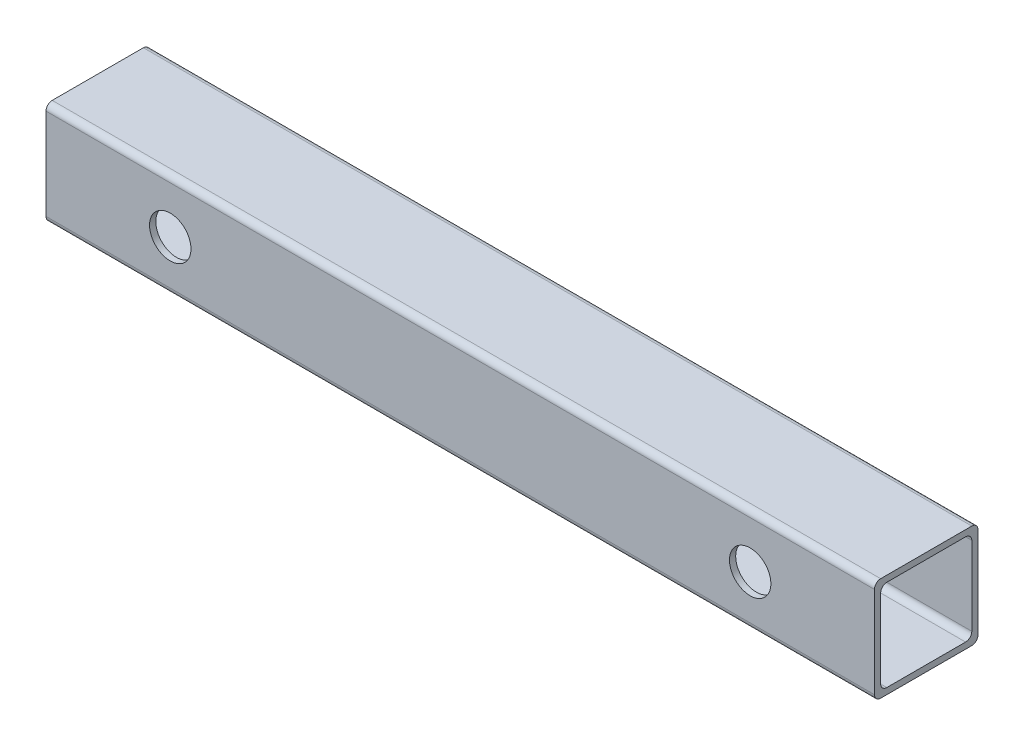
ISO-10303-21;
HEADER;
FILE_DESCRIPTION(('STEP AP214'),'2;1');
FILE_NAME('part.step','',(''),(''),'','','');
FILE_SCHEMA(('AUTOMOTIVE_DESIGN { 1 0 10303 214 1 1 1 1 }'));
ENDSEC;
DATA;
#1=APPLICATION_CONTEXT('core data for automotive mechanical design processes');
#2=APPLICATION_PROTOCOL_DEFINITION('international standard','automotive_design',2000,#1);
#3=PRODUCT_CONTEXT('',#1,'mechanical');
#4=PRODUCT('Part','Part','',(#3));
#5=PRODUCT_RELATED_PRODUCT_CATEGORY('part','',(#4));
#6=PRODUCT_DEFINITION_FORMATION('','',#4);
#7=PRODUCT_DEFINITION_CONTEXT('part definition',#1,'design');
#8=PRODUCT_DEFINITION('design','',#6,#7);
#9=PRODUCT_DEFINITION_SHAPE('','',#8);
#10=(LENGTH_UNIT() NAMED_UNIT(*) SI_UNIT(.MILLI.,.METRE.));
#11=(NAMED_UNIT(*) PLANE_ANGLE_UNIT() SI_UNIT($,.RADIAN.));
#12=(NAMED_UNIT(*) SI_UNIT($,.STERADIAN.) SOLID_ANGLE_UNIT());
#13=UNCERTAINTY_MEASURE_WITH_UNIT(LENGTH_MEASURE(1.E-05),#10,'distance_accuracy_value','');
#14=(GEOMETRIC_REPRESENTATION_CONTEXT(3) GLOBAL_UNCERTAINTY_ASSIGNED_CONTEXT((#13)) GLOBAL_UNIT_ASSIGNED_CONTEXT((#10,
#11,#12)) REPRESENTATION_CONTEXT('',''));
#15=CARTESIAN_POINT('',(0.,0.,0.));
#16=DIRECTION('',(0.,0.,1.));
#17=DIRECTION('',(1.,0.,0.));
#18=AXIS2_PLACEMENT_3D('',#15,#16,#17);
#19=CARTESIAN_POINT('',(200.,23.5,-23.5));
#20=DIRECTION('',(-1.,0.,0.));
#21=DIRECTION('',(0.,0.,1.));
#22=AXIS2_PLACEMENT_3D('',#19,#20,#21);
#23=PLANE('',#22);
#24=CARTESIAN_POINT('',(200.,23.5,-23.5));
#25=DIRECTION('',(1.,0.,0.));
#26=DIRECTION('',(0.,0.,1.));
#27=AXIS2_PLACEMENT_3D('',#24,#25,#26);
#28=CIRCLE('',#27,1.5);
#29=CARTESIAN_POINT('',(200.,23.5,-25.));
#30=VERTEX_POINT('',#29);
#31=CARTESIAN_POINT('',(200.,25.,-23.5));
#32=VERTEX_POINT('',#31);
#33=EDGE_CURVE('E215',#30,#32,#28,.T.);
#34=ORIENTED_EDGE('',*,*,#33,.T.);
#35=DIRECTION('',(0.,0.,1.));
#36=VECTOR('',#35,1.);
#37=CARTESIAN_POINT('',(200.,25.,-1.50000000000001));
#38=LINE('',#37,#36);
#39=CARTESIAN_POINT('',(200.,25.,-1.50000000000001));
#40=VERTEX_POINT('',#39);
#41=EDGE_CURVE('E218',#32,#40,#38,.T.);
#42=ORIENTED_EDGE('',*,*,#41,.T.);
#43=CARTESIAN_POINT('',(200.,23.5,-1.5));
#44=DIRECTION('',(1.,0.,0.));
#45=DIRECTION('',(0.,0.,1.));
#46=AXIS2_PLACEMENT_3D('',#43,#44,#45);
#47=CIRCLE('',#46,1.5);
#48=CARTESIAN_POINT('',(200.,23.5,0.));
#49=VERTEX_POINT('',#48);
#50=EDGE_CURVE('E221',#40,#49,#47,.T.);
#51=ORIENTED_EDGE('',*,*,#50,.T.);
#52=DIRECTION('',(0.,-1.,0.));
#53=VECTOR('',#52,1.);
#54=CARTESIAN_POINT('',(200.,1.50000000000001,0.));
#55=LINE('',#54,#53);
#56=CARTESIAN_POINT('',(200.,1.50000000000001,0.));
#57=VERTEX_POINT('',#56);
#58=EDGE_CURVE('E223',#49,#57,#55,.T.);
#59=ORIENTED_EDGE('',*,*,#58,.T.);
#60=CARTESIAN_POINT('',(200.,1.5,-1.5));
#61=DIRECTION('',(1.,0.,0.));
#62=DIRECTION('',(0.,0.,1.));
#63=AXIS2_PLACEMENT_3D('',#60,#61,#62);
#64=CIRCLE('',#63,1.5);
#65=CARTESIAN_POINT('',(200.,0.,-1.50000000000001));
#66=VERTEX_POINT('',#65);
#67=EDGE_CURVE('E225',#57,#66,#64,.T.);
#68=ORIENTED_EDGE('',*,*,#67,.T.);
#69=DIRECTION('',(0.,0.,-1.));
#70=VECTOR('',#69,1.);
#71=CARTESIAN_POINT('',(200.,0.,-1.50000000000001));
#72=LINE('',#71,#70);
#73=CARTESIAN_POINT('',(200.,0.,-23.5));
#74=VERTEX_POINT('',#73);
#75=EDGE_CURVE('E227',#66,#74,#72,.T.);
#76=ORIENTED_EDGE('',*,*,#75,.T.);
#77=CARTESIAN_POINT('',(200.,1.5,-23.5));
#78=DIRECTION('',(1.,0.,0.));
#79=DIRECTION('',(0.,0.,-1.));
#80=AXIS2_PLACEMENT_3D('',#77,#78,#79);
#81=CIRCLE('',#80,1.5);
#82=CARTESIAN_POINT('',(200.,1.5,-25.));
#83=VERTEX_POINT('',#82);
#84=EDGE_CURVE('E229',#74,#83,#81,.T.);
#85=ORIENTED_EDGE('',*,*,#84,.T.);
#86=DIRECTION('',(0.,1.,0.));
#87=VECTOR('',#86,1.);
#88=CARTESIAN_POINT('',(200.,1.50000000000001,-25.));
#89=LINE('',#88,#87);
#90=EDGE_CURVE('E231',#83,#30,#89,.T.);
#91=ORIENTED_EDGE('',*,*,#90,.T.);
#92=EDGE_LOOP('',(#34,#42,#51,#59,#68,#76,#85,#91));
#93=FACE_BOUND('',#92,.T.);
#94=CARTESIAN_POINT('',(200.,22.,-22.));
#95=DIRECTION('',(1.,0.,0.));
#96=DIRECTION('',(0.,0.,1.));
#97=AXIS2_PLACEMENT_3D('',#94,#95,#96);
#98=CIRCLE('',#97,1.5);
#99=CARTESIAN_POINT('',(200.,22.,-23.5));
#100=VERTEX_POINT('',#99);
#101=CARTESIAN_POINT('',(200.,23.5,-22.));
#102=VERTEX_POINT('',#101);
#103=EDGE_CURVE('E148',#100,#102,#98,.T.);
#104=ORIENTED_EDGE('',*,*,#103,.F.);
#105=DIRECTION('',(0.,1.,0.));
#106=VECTOR('',#105,1.);
#107=CARTESIAN_POINT('',(200.,22.,-23.5));
#108=LINE('',#107,#106);
#109=CARTESIAN_POINT('',(200.,3.,-23.5));
#110=VERTEX_POINT('',#109);
#111=EDGE_CURVE('E182',#110,#100,#108,.T.);
#112=ORIENTED_EDGE('',*,*,#111,.F.);
#113=CARTESIAN_POINT('',(200.,3.,-22.));
#114=DIRECTION('',(1.,0.,0.));
#115=DIRECTION('',(0.,0.,-1.));
#116=AXIS2_PLACEMENT_3D('',#113,#114,#115);
#117=CIRCLE('',#116,1.5);
#118=CARTESIAN_POINT('',(200.,1.5,-22.));
#119=VERTEX_POINT('',#118);
#120=EDGE_CURVE('E180',#119,#110,#117,.T.);
#121=ORIENTED_EDGE('',*,*,#120,.F.);
#122=DIRECTION('',(0.,0.,-1.));
#123=VECTOR('',#122,1.);
#124=CARTESIAN_POINT('',(200.,1.5,-3.00000000000001));
#125=LINE('',#124,#123);
#126=CARTESIAN_POINT('',(200.,1.5,-3.00000000000001));
#127=VERTEX_POINT('',#126);
#128=EDGE_CURVE('E178',#127,#119,#125,.T.);
#129=ORIENTED_EDGE('',*,*,#128,.F.);
#130=CARTESIAN_POINT('',(200.,3.,-3.));
#131=DIRECTION('',(1.,0.,0.));
#132=DIRECTION('',(0.,0.,-1.));
#133=AXIS2_PLACEMENT_3D('',#130,#131,#132);
#134=CIRCLE('',#133,1.5);
#135=CARTESIAN_POINT('',(200.,3.00000000000001,-1.5));
#136=VERTEX_POINT('',#135);
#137=EDGE_CURVE('E176',#136,#127,#134,.T.);
#138=ORIENTED_EDGE('',*,*,#137,.F.);
#139=DIRECTION('',(0.,-1.,0.));
#140=VECTOR('',#139,1.);
#141=CARTESIAN_POINT('',(200.,22.,-1.5));
#142=LINE('',#141,#140);
#143=CARTESIAN_POINT('',(200.,22.,-1.5));
#144=VERTEX_POINT('',#143);
#145=EDGE_CURVE('E171',#144,#136,#142,.T.);
#146=ORIENTED_EDGE('',*,*,#145,.F.);
#147=CARTESIAN_POINT('',(200.,22.,-3.));
#148=DIRECTION('',(1.,0.,0.));
#149=DIRECTION('',(0.,0.,1.));
#150=AXIS2_PLACEMENT_3D('',#147,#148,#149);
#151=CIRCLE('',#150,1.5);
#152=CARTESIAN_POINT('',(200.,23.5,-3.00000000000001));
#153=VERTEX_POINT('',#152);
#154=EDGE_CURVE('E169',#153,#144,#151,.T.);
#155=ORIENTED_EDGE('',*,*,#154,.F.);
#156=DIRECTION('',(0.,0.,1.));
#157=VECTOR('',#156,1.);
#158=CARTESIAN_POINT('',(200.,23.5,-3.00000000000001));
#159=LINE('',#158,#157);
#160=EDGE_CURVE('E156',#102,#153,#159,.T.);
#161=ORIENTED_EDGE('',*,*,#160,.F.);
#162=EDGE_LOOP('',(#104,#112,#121,#129,#138,#146,#155,#161));
#163=FACE_BOUND('',#162,.T.);
#164=ADVANCED_FACE('F33',(#93,#163),#23,.F.);
#165=CARTESIAN_POINT('',(0.,23.5,-23.5));
#166=DIRECTION('',(-1.,0.,0.));
#167=DIRECTION('',(0.,0.,1.));
#168=AXIS2_PLACEMENT_3D('',#165,#166,#167);
#169=PLANE('',#168);
#170=CARTESIAN_POINT('',(0.,23.5,-23.5));
#171=DIRECTION('',(1.,0.,0.));
#172=DIRECTION('',(0.,0.,1.));
#173=AXIS2_PLACEMENT_3D('',#170,#171,#172);
#174=CIRCLE('',#173,1.5);
#175=CARTESIAN_POINT('',(0.,23.5,-25.));
#176=VERTEX_POINT('',#175);
#177=CARTESIAN_POINT('',(0.,25.,-23.5));
#178=VERTEX_POINT('',#177);
#179=EDGE_CURVE('E164',#176,#178,#174,.T.);
#180=ORIENTED_EDGE('',*,*,#179,.F.);
#181=DIRECTION('',(0.,1.,0.));
#182=VECTOR('',#181,1.);
#183=CARTESIAN_POINT('',(0.,1.50000000000001,-25.));
#184=LINE('',#183,#182);
#185=CARTESIAN_POINT('',(0.,1.5,-25.));
#186=VERTEX_POINT('',#185);
#187=EDGE_CURVE('E219',#186,#176,#184,.T.);
#188=ORIENTED_EDGE('',*,*,#187,.F.);
#189=CARTESIAN_POINT('',(0.,1.5,-23.5));
#190=DIRECTION('',(1.,0.,0.));
#191=DIRECTION('',(0.,0.,-1.));
#192=AXIS2_PLACEMENT_3D('',#189,#190,#191);
#193=CIRCLE('',#192,1.5);
#194=CARTESIAN_POINT('',(0.,0.,-23.5));
#195=VERTEX_POINT('',#194);
#196=EDGE_CURVE('E246',#195,#186,#193,.T.);
#197=ORIENTED_EDGE('',*,*,#196,.F.);
#198=DIRECTION('',(0.,0.,-1.));
#199=VECTOR('',#198,1.);
#200=CARTESIAN_POINT('',(0.,0.,-1.50000000000001));
#201=LINE('',#200,#199);
#202=CARTESIAN_POINT('',(0.,0.,-1.50000000000001));
#203=VERTEX_POINT('',#202);
#204=EDGE_CURVE('E244',#203,#195,#201,.T.);
#205=ORIENTED_EDGE('',*,*,#204,.F.);
#206=CARTESIAN_POINT('',(0.,1.5,-1.5));
#207=DIRECTION('',(1.,0.,0.));
#208=DIRECTION('',(0.,0.,1.));
#209=AXIS2_PLACEMENT_3D('',#206,#207,#208);
#210=CIRCLE('',#209,1.5);
#211=CARTESIAN_POINT('',(0.,1.50000000000001,0.));
#212=VERTEX_POINT('',#211);
#213=EDGE_CURVE('E242',#212,#203,#210,.T.);
#214=ORIENTED_EDGE('',*,*,#213,.F.);
#215=DIRECTION('',(0.,-1.,0.));
#216=VECTOR('',#215,1.);
#217=CARTESIAN_POINT('',(0.,1.50000000000001,0.));
#218=LINE('',#217,#216);
#219=CARTESIAN_POINT('',(0.,23.5,0.));
#220=VERTEX_POINT('',#219);
#221=EDGE_CURVE('E240',#220,#212,#218,.T.);
#222=ORIENTED_EDGE('',*,*,#221,.F.);
#223=CARTESIAN_POINT('',(0.,23.5,-1.5));
#224=DIRECTION('',(1.,0.,0.));
#225=DIRECTION('',(0.,0.,1.));
#226=AXIS2_PLACEMENT_3D('',#223,#224,#225);
#227=CIRCLE('',#226,1.5);
#228=CARTESIAN_POINT('',(0.,25.,-1.50000000000001));
#229=VERTEX_POINT('',#228);
#230=EDGE_CURVE('E238',#229,#220,#227,.T.);
#231=ORIENTED_EDGE('',*,*,#230,.F.);
#232=DIRECTION('',(0.,0.,1.));
#233=VECTOR('',#232,1.);
#234=CARTESIAN_POINT('',(0.,25.,-1.50000000000001));
#235=LINE('',#234,#233);
#236=EDGE_CURVE('E236',#178,#229,#235,.T.);
#237=ORIENTED_EDGE('',*,*,#236,.F.);
#238=EDGE_LOOP('',(#180,#188,#197,#205,#214,#222,#231,#237));
#239=FACE_BOUND('',#238,.T.);
#240=DIRECTION('',(0.,1.,0.));
#241=VECTOR('',#240,1.);
#242=CARTESIAN_POINT('',(0.,22.,-23.5));
#243=LINE('',#242,#241);
#244=CARTESIAN_POINT('',(0.,3.,-23.5));
#245=VERTEX_POINT('',#244);
#246=CARTESIAN_POINT('',(0.,22.,-23.5));
#247=VERTEX_POINT('',#246);
#248=EDGE_CURVE('E157',#245,#247,#243,.T.);
#249=ORIENTED_EDGE('',*,*,#248,.T.);
#250=CARTESIAN_POINT('',(0.,22.,-22.));
#251=DIRECTION('',(1.,0.,0.));
#252=DIRECTION('',(0.,0.,1.));
#253=AXIS2_PLACEMENT_3D('',#250,#251,#252);
#254=CIRCLE('',#253,1.5);
#255=CARTESIAN_POINT('',(0.,23.5,-22.));
#256=VERTEX_POINT('',#255);
#257=EDGE_CURVE('E58',#247,#256,#254,.T.);
#258=ORIENTED_EDGE('',*,*,#257,.T.);
#259=DIRECTION('',(0.,0.,1.));
#260=VECTOR('',#259,1.);
#261=CARTESIAN_POINT('',(0.,23.5,-3.00000000000001));
#262=LINE('',#261,#260);
#263=CARTESIAN_POINT('',(0.,23.5,-3.00000000000001));
#264=VERTEX_POINT('',#263);
#265=EDGE_CURVE('E163',#256,#264,#262,.T.);
#266=ORIENTED_EDGE('',*,*,#265,.T.);
#267=CARTESIAN_POINT('',(0.,22.,-3.));
#268=DIRECTION('',(1.,0.,0.));
#269=DIRECTION('',(0.,0.,1.));
#270=AXIS2_PLACEMENT_3D('',#267,#268,#269);
#271=CIRCLE('',#270,1.5);
#272=CARTESIAN_POINT('',(0.,22.,-1.5));
#273=VERTEX_POINT('',#272);
#274=EDGE_CURVE('E187',#264,#273,#271,.T.);
#275=ORIENTED_EDGE('',*,*,#274,.T.);
#276=DIRECTION('',(0.,-1.,0.));
#277=VECTOR('',#276,1.);
#278=CARTESIAN_POINT('',(0.,22.,-1.5));
#279=LINE('',#278,#277);
#280=CARTESIAN_POINT('',(0.,3.00000000000001,-1.5));
#281=VERTEX_POINT('',#280);
#282=EDGE_CURVE('E190',#273,#281,#279,.T.);
#283=ORIENTED_EDGE('',*,*,#282,.T.);
#284=CARTESIAN_POINT('',(0.,3.,-3.));
#285=DIRECTION('',(1.,0.,0.));
#286=DIRECTION('',(0.,0.,-1.));
#287=AXIS2_PLACEMENT_3D('',#284,#285,#286);
#288=CIRCLE('',#287,1.5);
#289=CARTESIAN_POINT('',(0.,1.5,-3.00000000000001));
#290=VERTEX_POINT('',#289);
#291=EDGE_CURVE('E193',#281,#290,#288,.T.);
#292=ORIENTED_EDGE('',*,*,#291,.T.);
#293=DIRECTION('',(0.,0.,-1.));
#294=VECTOR('',#293,1.);
#295=CARTESIAN_POINT('',(0.,1.5,-3.00000000000001));
#296=LINE('',#295,#294);
#297=CARTESIAN_POINT('',(0.,1.5,-22.));
#298=VERTEX_POINT('',#297);
#299=EDGE_CURVE('E196',#290,#298,#296,.T.);
#300=ORIENTED_EDGE('',*,*,#299,.T.);
#301=CARTESIAN_POINT('',(0.,3.,-22.));
#302=DIRECTION('',(1.,0.,0.));
#303=DIRECTION('',(0.,0.,-1.));
#304=AXIS2_PLACEMENT_3D('',#301,#302,#303);
#305=CIRCLE('',#304,1.5);
#306=EDGE_CURVE('E199',#298,#245,#305,.T.);
#307=ORIENTED_EDGE('',*,*,#306,.T.);
#308=EDGE_LOOP('',(#249,#258,#266,#275,#283,#292,#300,#307));
#309=FACE_BOUND('',#308,.T.);
#310=ADVANCED_FACE('F305',(#239,#309),#169,.T.);
#311=CARTESIAN_POINT('',(200.,23.5,-23.5));
#312=DIRECTION('',(-1.,0.,0.));
#313=DIRECTION('',(0.,0.,1.));
#314=AXIS2_PLACEMENT_3D('',#311,#312,#313);
#315=CYLINDRICAL_SURFACE('',#314,1.5);
#316=ORIENTED_EDGE('',*,*,#179,.T.);
#317=DIRECTION('',(-1.,0.,0.));
#318=VECTOR('',#317,1.);
#319=CARTESIAN_POINT('',(200.,25.,-23.5));
#320=LINE('',#319,#318);
#321=EDGE_CURVE('E11',#32,#178,#320,.T.);
#322=ORIENTED_EDGE('',*,*,#321,.F.);
#323=ORIENTED_EDGE('',*,*,#33,.F.);
#324=DIRECTION('',(-1.,0.,0.));
#325=VECTOR('',#324,1.);
#326=CARTESIAN_POINT('',(200.,23.5,-25.));
#327=LINE('',#326,#325);
#328=EDGE_CURVE('E233',#30,#176,#327,.T.);
#329=ORIENTED_EDGE('',*,*,#328,.T.);
#330=EDGE_LOOP('',(#316,#322,#323,#329));
#331=FACE_BOUND('',#330,.T.);
#332=ADVANCED_FACE('F35',(#331),#315,.T.);
#333=CARTESIAN_POINT('',(200.,25.,-1.50000000000001));
#334=DIRECTION('',(0.,-1.,0.));
#335=DIRECTION('',(0.,0.,-1.));
#336=AXIS2_PLACEMENT_3D('',#333,#334,#335);
#337=PLANE('',#336);
#338=ORIENTED_EDGE('',*,*,#236,.T.);
#339=DIRECTION('',(-1.,0.,0.));
#340=VECTOR('',#339,1.);
#341=CARTESIAN_POINT('',(200.,25.,-1.50000000000001));
#342=LINE('',#341,#340);
#343=EDGE_CURVE('E42',#40,#229,#342,.T.);
#344=ORIENTED_EDGE('',*,*,#343,.F.);
#345=ORIENTED_EDGE('',*,*,#41,.F.);
#346=ORIENTED_EDGE('',*,*,#321,.T.);
#347=EDGE_LOOP('',(#338,#344,#345,#346));
#348=FACE_BOUND('',#347,.T.);
#349=ADVANCED_FACE('F367',(#348),#337,.F.);
#350=CARTESIAN_POINT('',(200.,23.5,-1.5));
#351=DIRECTION('',(-1.,0.,0.));
#352=DIRECTION('',(0.,0.,1.));
#353=AXIS2_PLACEMENT_3D('',#350,#351,#352);
#354=CYLINDRICAL_SURFACE('',#353,1.5);
#355=ORIENTED_EDGE('',*,*,#230,.T.);
#356=DIRECTION('',(-1.,0.,0.));
#357=VECTOR('',#356,1.);
#358=CARTESIAN_POINT('',(200.,23.5,0.));
#359=LINE('',#358,#357);
#360=EDGE_CURVE('E263',#49,#220,#359,.T.);
#361=ORIENTED_EDGE('',*,*,#360,.F.);
#362=ORIENTED_EDGE('',*,*,#50,.F.);
#363=ORIENTED_EDGE('',*,*,#343,.T.);
#364=EDGE_LOOP('',(#355,#361,#362,#363));
#365=FACE_BOUND('',#364,.T.);
#366=ADVANCED_FACE('F365',(#365),#354,.T.);
#367=CARTESIAN_POINT('',(200.,1.50000000000001,0.));
#368=DIRECTION('',(0.,0.,-1.));
#369=DIRECTION('',(-1.,0.,0.));
#370=AXIS2_PLACEMENT_3D('',#367,#368,#369);
#371=PLANE('',#370);
#372=CARTESIAN_POINT('',(170.,12.1767137957337,0.));
#373=DIRECTION('',(0.,0.,-1.));
#374=DIRECTION('',(-1.,0.,0.));
#375=AXIS2_PLACEMENT_3D('',#372,#373,#374);
#376=CIRCLE('',#375,4.99999999999999);
#377=CARTESIAN_POINT('',(165.,12.1767137957337,0.));
#378=VERTEX_POINT('',#377);
#379=EDGE_CURVE('E270',#378,#378,#376,.T.);
#380=ORIENTED_EDGE('',*,*,#379,.T.);
#381=EDGE_LOOP('',(#380));
#382=FACE_BOUND('',#381,.T.);
#383=CARTESIAN_POINT('',(30.,12.1767137957337,0.));
#384=DIRECTION('',(0.,0.,-1.));
#385=DIRECTION('',(-1.,0.,0.));
#386=AXIS2_PLACEMENT_3D('',#383,#384,#385);
#387=CIRCLE('',#386,4.99999999999999);
#388=CARTESIAN_POINT('',(25.,12.1767137957337,0.));
#389=VERTEX_POINT('',#388);
#390=EDGE_CURVE('E281',#389,#389,#387,.T.);
#391=ORIENTED_EDGE('',*,*,#390,.T.);
#392=EDGE_LOOP('',(#391));
#393=FACE_BOUND('',#392,.T.);
#394=ORIENTED_EDGE('',*,*,#221,.T.);
#395=DIRECTION('',(-1.,0.,0.));
#396=VECTOR('',#395,1.);
#397=CARTESIAN_POINT('',(200.,1.50000000000001,0.));
#398=LINE('',#397,#396);
#399=EDGE_CURVE('E260',#57,#212,#398,.T.);
#400=ORIENTED_EDGE('',*,*,#399,.F.);
#401=ORIENTED_EDGE('',*,*,#58,.F.);
#402=ORIENTED_EDGE('',*,*,#360,.T.);
#403=EDGE_LOOP('',(#394,#400,#401,#402));
#404=FACE_BOUND('',#403,.T.);
#405=ADVANCED_FACE('F361',(#382,#393,#404),#371,.F.);
#406=CARTESIAN_POINT('',(200.,1.5,-1.5));
#407=DIRECTION('',(-1.,0.,0.));
#408=DIRECTION('',(0.,0.,1.));
#409=AXIS2_PLACEMENT_3D('',#406,#407,#408);
#410=CYLINDRICAL_SURFACE('',#409,1.5);
#411=ORIENTED_EDGE('',*,*,#213,.T.);
#412=DIRECTION('',(-1.,0.,0.));
#413=VECTOR('',#412,1.);
#414=CARTESIAN_POINT('',(200.,0.,-1.50000000000001));
#415=LINE('',#414,#413);
#416=EDGE_CURVE('E257',#66,#203,#415,.T.);
#417=ORIENTED_EDGE('',*,*,#416,.F.);
#418=ORIENTED_EDGE('',*,*,#67,.F.);
#419=ORIENTED_EDGE('',*,*,#399,.T.);
#420=EDGE_LOOP('',(#411,#417,#418,#419));
#421=FACE_BOUND('',#420,.T.);
#422=ADVANCED_FACE('F357',(#421),#410,.T.);
#423=CARTESIAN_POINT('',(200.,0.,-1.50000000000001));
#424=DIRECTION('',(0.,1.,0.));
#425=DIRECTION('',(0.,0.,1.));
#426=AXIS2_PLACEMENT_3D('',#423,#424,#425);
#427=PLANE('',#426);
#428=ORIENTED_EDGE('',*,*,#204,.T.);
#429=DIRECTION('',(-1.,0.,0.));
#430=VECTOR('',#429,1.);
#431=CARTESIAN_POINT('',(200.,0.,-23.5));
#432=LINE('',#431,#430);
#433=EDGE_CURVE('E254',#74,#195,#432,.T.);
#434=ORIENTED_EDGE('',*,*,#433,.F.);
#435=ORIENTED_EDGE('',*,*,#75,.F.);
#436=ORIENTED_EDGE('',*,*,#416,.T.);
#437=EDGE_LOOP('',(#428,#434,#435,#436));
#438=FACE_BOUND('',#437,.T.);
#439=ADVANCED_FACE('F353',(#438),#427,.F.);
#440=CARTESIAN_POINT('',(200.,1.5,-23.5));
#441=DIRECTION('',(-1.,0.,0.));
#442=DIRECTION('',(0.,0.,1.));
#443=AXIS2_PLACEMENT_3D('',#440,#441,#442);
#444=CYLINDRICAL_SURFACE('',#443,1.5);
#445=ORIENTED_EDGE('',*,*,#196,.T.);
#446=DIRECTION('',(-1.,0.,0.));
#447=VECTOR('',#446,1.);
#448=CARTESIAN_POINT('',(200.,1.5,-25.));
#449=LINE('',#448,#447);
#450=EDGE_CURVE('E251',#83,#186,#449,.T.);
#451=ORIENTED_EDGE('',*,*,#450,.F.);
#452=ORIENTED_EDGE('',*,*,#84,.F.);
#453=ORIENTED_EDGE('',*,*,#433,.T.);
#454=EDGE_LOOP('',(#445,#451,#452,#453));
#455=FACE_BOUND('',#454,.T.);
#456=ADVANCED_FACE('F349',(#455),#444,.T.);
#457=CARTESIAN_POINT('',(200.,1.50000000000001,-25.));
#458=DIRECTION('',(0.,0.,1.));
#459=DIRECTION('',(1.,0.,0.));
#460=AXIS2_PLACEMENT_3D('',#457,#458,#459);
#461=PLANE('',#460);
#462=CARTESIAN_POINT('',(170.,12.1767137957337,-25.));
#463=DIRECTION('',(0.,0.,-1.));
#464=DIRECTION('',(-1.,0.,0.));
#465=AXIS2_PLACEMENT_3D('',#462,#463,#464);
#466=CIRCLE('',#465,4.99999999999999);
#467=CARTESIAN_POINT('',(165.,12.1767137957337,-25.));
#468=VERTEX_POINT('',#467);
#469=EDGE_CURVE('E276',#468,#468,#466,.T.);
#470=ORIENTED_EDGE('',*,*,#469,.F.);
#471=EDGE_LOOP('',(#470));
#472=FACE_BOUND('',#471,.T.);
#473=CARTESIAN_POINT('',(30.,12.1767137957337,-25.));
#474=DIRECTION('',(0.,0.,-1.));
#475=DIRECTION('',(-1.,0.,0.));
#476=AXIS2_PLACEMENT_3D('',#473,#474,#475);
#477=CIRCLE('',#476,4.99999999999999);
#478=CARTESIAN_POINT('',(25.,12.1767137957337,-25.));
#479=VERTEX_POINT('',#478);
#480=EDGE_CURVE('E286',#479,#479,#477,.T.);
#481=ORIENTED_EDGE('',*,*,#480,.F.);
#482=EDGE_LOOP('',(#481));
#483=FACE_BOUND('',#482,.T.);
#484=ORIENTED_EDGE('',*,*,#187,.T.);
#485=ORIENTED_EDGE('',*,*,#328,.F.);
#486=ORIENTED_EDGE('',*,*,#90,.F.);
#487=ORIENTED_EDGE('',*,*,#450,.T.);
#488=EDGE_LOOP('',(#484,#485,#486,#487));
#489=FACE_BOUND('',#488,.T.);
#490=ADVANCED_FACE('F346',(#472,#483,#489),#461,.F.);
#491=CARTESIAN_POINT('',(200.,22.,-22.));
#492=DIRECTION('',(-1.,0.,0.));
#493=DIRECTION('',(0.,0.,1.));
#494=AXIS2_PLACEMENT_3D('',#491,#492,#493);
#495=CYLINDRICAL_SURFACE('',#494,1.5);
#496=ORIENTED_EDGE('',*,*,#257,.F.);
#497=DIRECTION('',(-1.,0.,0.));
#498=VECTOR('',#497,1.);
#499=CARTESIAN_POINT('',(200.,22.,-23.5));
#500=LINE('',#499,#498);
#501=EDGE_CURVE('E152',#100,#247,#500,.T.);
#502=ORIENTED_EDGE('',*,*,#501,.F.);
#503=ORIENTED_EDGE('',*,*,#103,.T.);
#504=DIRECTION('',(-1.,0.,0.));
#505=VECTOR('',#504,1.);
#506=CARTESIAN_POINT('',(200.,23.5,-22.));
#507=LINE('',#506,#505);
#508=EDGE_CURVE('E151',#102,#256,#507,.T.);
#509=ORIENTED_EDGE('',*,*,#508,.T.);
#510=EDGE_LOOP('',(#496,#502,#503,#509));
#511=FACE_BOUND('',#510,.T.);
#512=ADVANCED_FACE('F150',(#511),#495,.F.);
#513=CARTESIAN_POINT('',(200.,23.5,-3.00000000000001));
#514=DIRECTION('',(0.,-1.,0.));
#515=DIRECTION('',(0.,0.,-1.));
#516=AXIS2_PLACEMENT_3D('',#513,#514,#515);
#517=PLANE('',#516);
#518=ORIENTED_EDGE('',*,*,#265,.F.);
#519=ORIENTED_EDGE('',*,*,#508,.F.);
#520=ORIENTED_EDGE('',*,*,#160,.T.);
#521=DIRECTION('',(-1.,0.,0.));
#522=VECTOR('',#521,1.);
#523=CARTESIAN_POINT('',(200.,23.5,-3.00000000000001));
#524=LINE('',#523,#522);
#525=EDGE_CURVE('E165',#153,#264,#524,.T.);
#526=ORIENTED_EDGE('',*,*,#525,.T.);
#527=EDGE_LOOP('',(#518,#519,#520,#526));
#528=FACE_BOUND('',#527,.T.);
#529=ADVANCED_FACE('F160',(#528),#517,.T.);
#530=CARTESIAN_POINT('',(200.,22.,-3.));
#531=DIRECTION('',(-1.,0.,0.));
#532=DIRECTION('',(0.,0.,1.));
#533=AXIS2_PLACEMENT_3D('',#530,#531,#532);
#534=CYLINDRICAL_SURFACE('',#533,1.5);
#535=ORIENTED_EDGE('',*,*,#274,.F.);
#536=ORIENTED_EDGE('',*,*,#525,.F.);
#537=ORIENTED_EDGE('',*,*,#154,.T.);
#538=DIRECTION('',(-1.,0.,0.));
#539=VECTOR('',#538,1.);
#540=CARTESIAN_POINT('',(200.,22.,-1.5));
#541=LINE('',#540,#539);
#542=EDGE_CURVE('E212',#144,#273,#541,.T.);
#543=ORIENTED_EDGE('',*,*,#542,.T.);
#544=EDGE_LOOP('',(#535,#536,#537,#543));
#545=FACE_BOUND('',#544,.T.);
#546=ADVANCED_FACE('F325',(#545),#534,.F.);
#547=CARTESIAN_POINT('',(200.,22.,-1.5));
#548=DIRECTION('',(0.,0.,-1.));
#549=DIRECTION('',(0.,1.,0.));
#550=AXIS2_PLACEMENT_3D('',#547,#548,#549);
#551=PLANE('',#550);
#552=CARTESIAN_POINT('',(170.,12.1767137957337,-1.5));
#553=DIRECTION('',(0.,0.,-1.));
#554=DIRECTION('',(0.,1.,0.));
#555=AXIS2_PLACEMENT_3D('',#552,#553,#554);
#556=CIRCLE('',#555,4.99999999999999);
#557=CARTESIAN_POINT('',(170.,17.1767137957337,-1.5));
#558=VERTEX_POINT('',#557);
#559=EDGE_CURVE('E185',#558,#558,#556,.T.);
#560=ORIENTED_EDGE('',*,*,#559,.F.);
#561=EDGE_LOOP('',(#560));
#562=FACE_BOUND('',#561,.T.);
#563=CARTESIAN_POINT('',(30.,12.1767137957337,-1.5));
#564=DIRECTION('',(0.,0.,-1.));
#565=DIRECTION('',(0.,1.,0.));
#566=AXIS2_PLACEMENT_3D('',#563,#564,#565);
#567=CIRCLE('',#566,4.99999999999999);
#568=CARTESIAN_POINT('',(30.,17.1767137957337,-1.5));
#569=VERTEX_POINT('',#568);
#570=EDGE_CURVE('E269',#569,#569,#567,.T.);
#571=ORIENTED_EDGE('',*,*,#570,.F.);
#572=EDGE_LOOP('',(#571));
#573=FACE_BOUND('',#572,.T.);
#574=ORIENTED_EDGE('',*,*,#282,.F.);
#575=ORIENTED_EDGE('',*,*,#542,.F.);
#576=ORIENTED_EDGE('',*,*,#145,.T.);
#577=DIRECTION('',(-1.,0.,0.));
#578=VECTOR('',#577,1.);
#579=CARTESIAN_POINT('',(200.,3.00000000000001,-1.5));
#580=LINE('',#579,#578);
#581=EDGE_CURVE('E210',#136,#281,#580,.T.);
#582=ORIENTED_EDGE('',*,*,#581,.T.);
#583=EDGE_LOOP('',(#574,#575,#576,#582));
#584=FACE_BOUND('',#583,.T.);
#585=ADVANCED_FACE('F321',(#562,#573,#584),#551,.T.);
#586=CARTESIAN_POINT('',(200.,3.,-3.));
#587=DIRECTION('',(-1.,0.,0.));
#588=DIRECTION('',(0.,0.,1.));
#589=AXIS2_PLACEMENT_3D('',#586,#587,#588);
#590=CYLINDRICAL_SURFACE('',#589,1.5);
#591=ORIENTED_EDGE('',*,*,#291,.F.);
#592=ORIENTED_EDGE('',*,*,#581,.F.);
#593=ORIENTED_EDGE('',*,*,#137,.T.);
#594=DIRECTION('',(-1.,0.,0.));
#595=VECTOR('',#594,1.);
#596=CARTESIAN_POINT('',(200.,1.5,-3.00000000000001));
#597=LINE('',#596,#595);
#598=EDGE_CURVE('E208',#127,#290,#597,.T.);
#599=ORIENTED_EDGE('',*,*,#598,.T.);
#600=EDGE_LOOP('',(#591,#592,#593,#599));
#601=FACE_BOUND('',#600,.T.);
#602=ADVANCED_FACE('F317',(#601),#590,.F.);
#603=CARTESIAN_POINT('',(200.,1.5,-3.00000000000001));
#604=DIRECTION('',(0.,1.,0.));
#605=DIRECTION('',(0.,0.,1.));
#606=AXIS2_PLACEMENT_3D('',#603,#604,#605);
#607=PLANE('',#606);
#608=ORIENTED_EDGE('',*,*,#299,.F.);
#609=ORIENTED_EDGE('',*,*,#598,.F.);
#610=ORIENTED_EDGE('',*,*,#128,.T.);
#611=DIRECTION('',(-1.,0.,0.));
#612=VECTOR('',#611,1.);
#613=CARTESIAN_POINT('',(200.,1.5,-22.));
#614=LINE('',#613,#612);
#615=EDGE_CURVE('E206',#119,#298,#614,.T.);
#616=ORIENTED_EDGE('',*,*,#615,.T.);
#617=EDGE_LOOP('',(#608,#609,#610,#616));
#618=FACE_BOUND('',#617,.T.);
#619=ADVANCED_FACE('F314',(#618),#607,.T.);
#620=CARTESIAN_POINT('',(200.,3.,-22.));
#621=DIRECTION('',(-1.,0.,0.));
#622=DIRECTION('',(0.,0.,1.));
#623=AXIS2_PLACEMENT_3D('',#620,#621,#622);
#624=CYLINDRICAL_SURFACE('',#623,1.5);
#625=ORIENTED_EDGE('',*,*,#306,.F.);
#626=ORIENTED_EDGE('',*,*,#615,.F.);
#627=ORIENTED_EDGE('',*,*,#120,.T.);
#628=DIRECTION('',(-1.,0.,0.));
#629=VECTOR('',#628,1.);
#630=CARTESIAN_POINT('',(200.,3.,-23.5));
#631=LINE('',#630,#629);
#632=EDGE_CURVE('E50',#110,#245,#631,.T.);
#633=ORIENTED_EDGE('',*,*,#632,.T.);
#634=EDGE_LOOP('',(#625,#626,#627,#633));
#635=FACE_BOUND('',#634,.T.);
#636=ADVANCED_FACE('F301',(#635),#624,.F.);
#637=CARTESIAN_POINT('',(200.,22.,-23.5));
#638=DIRECTION('',(0.,0.,1.));
#639=DIRECTION('',(0.,-1.,0.));
#640=AXIS2_PLACEMENT_3D('',#637,#638,#639);
#641=PLANE('',#640);
#642=CARTESIAN_POINT('',(170.,12.1767137957337,-23.5));
#643=DIRECTION('',(0.,0.,1.));
#644=DIRECTION('',(0.,-1.,0.));
#645=AXIS2_PLACEMENT_3D('',#642,#643,#644);
#646=CIRCLE('',#645,4.99999999999999);
#647=CARTESIAN_POINT('',(170.,7.17671379573374,-23.5));
#648=VERTEX_POINT('',#647);
#649=EDGE_CURVE('E37',#648,#648,#646,.T.);
#650=ORIENTED_EDGE('',*,*,#649,.F.);
#651=EDGE_LOOP('',(#650));
#652=FACE_BOUND('',#651,.T.);
#653=CARTESIAN_POINT('',(30.,12.1767137957337,-23.5));
#654=DIRECTION('',(0.,0.,1.));
#655=DIRECTION('',(0.,-1.,0.));
#656=AXIS2_PLACEMENT_3D('',#653,#654,#655);
#657=CIRCLE('',#656,4.99999999999999);
#658=CARTESIAN_POINT('',(30.,7.17671379573374,-23.5));
#659=VERTEX_POINT('',#658);
#660=EDGE_CURVE('E267',#659,#659,#657,.T.);
#661=ORIENTED_EDGE('',*,*,#660,.F.);
#662=EDGE_LOOP('',(#661));
#663=FACE_BOUND('',#662,.T.);
#664=ORIENTED_EDGE('',*,*,#248,.F.);
#665=ORIENTED_EDGE('',*,*,#632,.F.);
#666=ORIENTED_EDGE('',*,*,#111,.T.);
#667=ORIENTED_EDGE('',*,*,#501,.T.);
#668=EDGE_LOOP('',(#664,#665,#666,#667));
#669=FACE_BOUND('',#668,.T.);
#670=ADVANCED_FACE('F297',(#652,#663,#669),#641,.T.);
#671=CARTESIAN_POINT('',(30.,12.1767137957337,0.));
#672=DIRECTION('',(0.,0.,-1.));
#673=DIRECTION('',(-1.,0.,0.));
#674=AXIS2_PLACEMENT_3D('',#671,#672,#673);
#675=CYLINDRICAL_SURFACE('',#674,4.99999999999999);
#676=ORIENTED_EDGE('',*,*,#660,.T.);
#677=EDGE_LOOP('',(#676));
#678=FACE_BOUND('',#677,.T.);
#679=ORIENTED_EDGE('',*,*,#480,.T.);
#680=EDGE_LOOP('',(#679));
#681=FACE_BOUND('',#680,.T.);
#682=ADVANCED_FACE('F300',(#678,#681),#675,.F.);
#683=CARTESIAN_POINT('',(170.,12.1767137957337,0.));
#684=DIRECTION('',(0.,0.,-1.));
#685=DIRECTION('',(-1.,0.,0.));
#686=AXIS2_PLACEMENT_3D('',#683,#684,#685);
#687=CYLINDRICAL_SURFACE('',#686,4.99999999999999);
#688=ORIENTED_EDGE('',*,*,#649,.T.);
#689=EDGE_LOOP('',(#688));
#690=FACE_BOUND('',#689,.T.);
#691=ORIENTED_EDGE('',*,*,#469,.T.);
#692=EDGE_LOOP('',(#691));
#693=FACE_BOUND('',#692,.T.);
#694=ADVANCED_FACE('F294',(#690,#693),#687,.F.);
#695=ORIENTED_EDGE('',*,*,#570,.T.);
#696=EDGE_LOOP('',(#695));
#697=FACE_BOUND('',#696,.T.);
#698=ORIENTED_EDGE('',*,*,#390,.F.);
#699=EDGE_LOOP('',(#698));
#700=FACE_BOUND('',#699,.T.);
#701=ADVANCED_FACE('F501',(#697,#700),#675,.F.);
#702=ORIENTED_EDGE('',*,*,#559,.T.);
#703=EDGE_LOOP('',(#702));
#704=FACE_BOUND('',#703,.T.);
#705=ORIENTED_EDGE('',*,*,#379,.F.);
#706=EDGE_LOOP('',(#705));
#707=FACE_BOUND('',#706,.T.);
#708=ADVANCED_FACE('F509',(#704,#707),#687,.F.);
#709=CLOSED_SHELL('',(#164,#310,#332,#349,#366,#405,#422,#439,#456,#490,#512,#529,#546,#585,
#602,#619,#636,#670,#682,#694,#701,#708));
#710=MANIFOLD_SOLID_BREP('B2',#709);
#711=ADVANCED_BREP_SHAPE_REPRESENTATION('',(#18,#710),#14);
#712=SHAPE_DEFINITION_REPRESENTATION(#9,#711);
ENDSEC;
END-ISO-10303-21;
